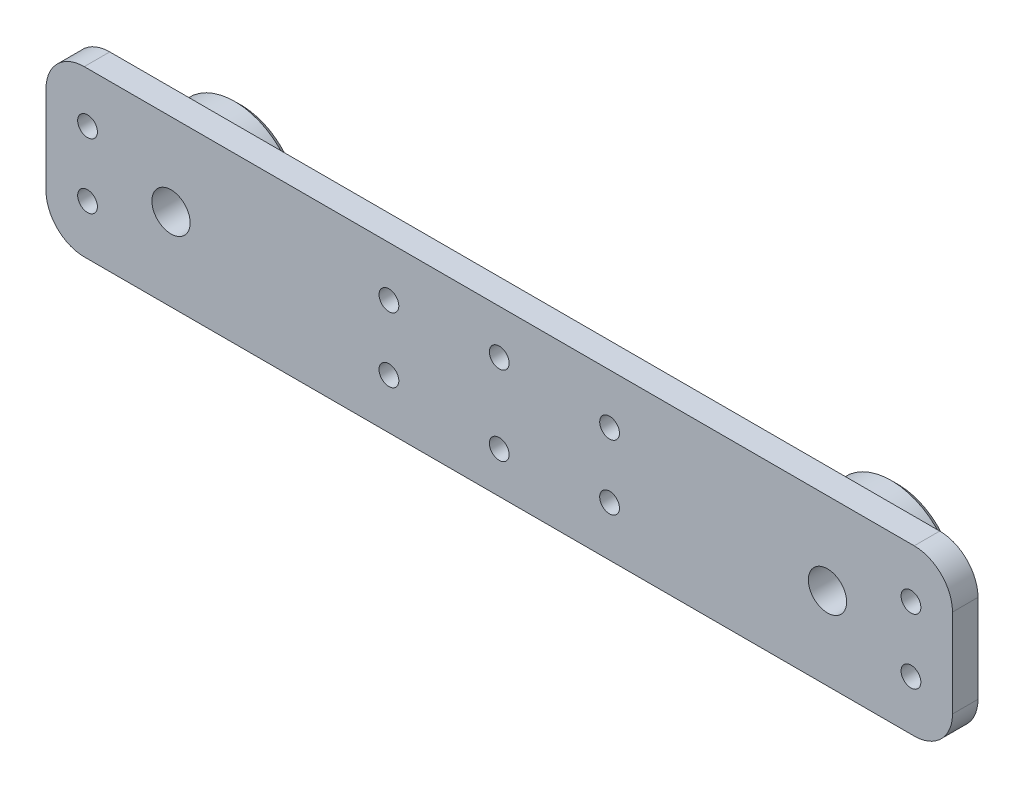
ISO-10303-21;
HEADER;
FILE_DESCRIPTION(('STEP AP214'),'2;1');
FILE_NAME('part.step','',(''),(''),'','','');
FILE_SCHEMA(('AUTOMOTIVE_DESIGN { 1 0 10303 214 1 1 1 1 }'));
ENDSEC;
DATA;
#1=APPLICATION_CONTEXT('core data for automotive mechanical design processes');
#2=APPLICATION_PROTOCOL_DEFINITION('international standard','automotive_design',2000,#1);
#3=PRODUCT_CONTEXT('',#1,'mechanical');
#4=PRODUCT('Part','Part','',(#3));
#5=PRODUCT_RELATED_PRODUCT_CATEGORY('part','',(#4));
#6=PRODUCT_DEFINITION_FORMATION('','',#4);
#7=PRODUCT_DEFINITION_CONTEXT('part definition',#1,'design');
#8=PRODUCT_DEFINITION('design','',#6,#7);
#9=PRODUCT_DEFINITION_SHAPE('','',#8);
#10=(LENGTH_UNIT() NAMED_UNIT(*) SI_UNIT(.MILLI.,.METRE.));
#11=(NAMED_UNIT(*) PLANE_ANGLE_UNIT() SI_UNIT($,.RADIAN.));
#12=(NAMED_UNIT(*) SI_UNIT($,.STERADIAN.) SOLID_ANGLE_UNIT());
#13=UNCERTAINTY_MEASURE_WITH_UNIT(LENGTH_MEASURE(1.E-05),#10,'distance_accuracy_value','');
#14=(GEOMETRIC_REPRESENTATION_CONTEXT(3) GLOBAL_UNCERTAINTY_ASSIGNED_CONTEXT((#13)) GLOBAL_UNIT_ASSIGNED_CONTEXT((#10,
#11,#12)) REPRESENTATION_CONTEXT('',''));
#15=CARTESIAN_POINT('',(0.,0.,0.));
#16=DIRECTION('',(0.,0.,1.));
#17=DIRECTION('',(1.,0.,0.));
#18=AXIS2_PLACEMENT_3D('',#15,#16,#17);
#19=CARTESIAN_POINT('',(112.00000166893,35.000000075492,-4.27901249411549));
#20=DIRECTION('',(1.,0.,0.));
#21=DIRECTION('',(0.,0.,-1.));
#22=AXIS2_PLACEMENT_3D('',#19,#20,#21);
#23=PLANE('',#22);
#24=DIRECTION('',(0.,-1.,0.));
#25=VECTOR('',#24,1.);
#26=CARTESIAN_POINT('',(112.00000166893,35.000000075492,-8.2790124941155));
#27=LINE('',#26,#25);
#28=CARTESIAN_POINT('',(112.00000166893,29.000000075492,-8.27901249411551));
#29=VERTEX_POINT('',#28);
#30=CARTESIAN_POINT('',(112.00000166893,15.1580243665273,-8.27901249411555));
#31=VERTEX_POINT('',#30);
#32=EDGE_CURVE('E156',#29,#31,#27,.T.);
#33=ORIENTED_EDGE('',*,*,#32,.F.);
#34=DIRECTION('',(0.,0.,-1.));
#35=VECTOR('',#34,1.);
#36=CARTESIAN_POINT('',(112.00000166893,29.000000075492,-4.2790124941155));
#37=LINE('',#36,#35);
#38=CARTESIAN_POINT('',(112.00000166893,29.000000075492,-4.2790124941155));
#39=VERTEX_POINT('',#38);
#40=EDGE_CURVE('E147',#29,#39,#37,.F.);
#41=ORIENTED_EDGE('',*,*,#40,.T.);
#42=DIRECTION('',(0.,-1.,0.));
#43=VECTOR('',#42,1.);
#44=CARTESIAN_POINT('',(112.00000166893,35.000000075492,-4.27901249411549));
#45=LINE('',#44,#43);
#46=CARTESIAN_POINT('',(112.00000166893,15.1580243665273,-4.27901249411554));
#47=VERTEX_POINT('',#46);
#48=EDGE_CURVE('E153',#39,#47,#45,.T.);
#49=ORIENTED_EDGE('',*,*,#48,.T.);
#50=DIRECTION('',(0.,0.,-1.));
#51=VECTOR('',#50,1.);
#52=CARTESIAN_POINT('',(112.00000166893,15.1580243665273,-4.27901249411554));
#53=LINE('',#52,#51);
#54=EDGE_CURVE('E144',#47,#31,#53,.T.);
#55=ORIENTED_EDGE('',*,*,#54,.T.);
#56=EDGE_LOOP('',(#33,#41,#49,#55));
#57=FACE_BOUND('',#56,.T.);
#58=ADVANCED_FACE('F33',(#57),#23,.T.);
#59=CARTESIAN_POINT('',(-30.1427177643065,35.000000075492,-4.27901249411549));
#60=DIRECTION('',(0.,1.,0.));
#61=DIRECTION('',(0.,0.,1.));
#62=AXIS2_PLACEMENT_3D('',#59,#60,#61);
#63=PLANE('',#62);
#64=DIRECTION('',(1.,0.,0.));
#65=VECTOR('',#64,1.);
#66=CARTESIAN_POINT('',(-30.1427177643065,35.000000075492,-8.2790124941155));
#67=LINE('',#66,#65);
#68=CARTESIAN_POINT('',(-24.1427177643065,35.000000075492,-8.2790124941155));
#69=VERTEX_POINT('',#68);
#70=CARTESIAN_POINT('',(106.00000166893,35.000000075492,-8.2790124941155));
#71=VERTEX_POINT('',#70);
#72=EDGE_CURVE('E117',#69,#71,#67,.T.);
#73=ORIENTED_EDGE('',*,*,#72,.F.);
#74=DIRECTION('',(0.,0.,-1.));
#75=VECTOR('',#74,1.);
#76=CARTESIAN_POINT('',(-24.1427177643065,35.000000075492,-4.27901249411549));
#77=LINE('',#76,#75);
#78=CARTESIAN_POINT('',(-24.1427177643065,35.000000075492,-4.27901249411549));
#79=VERTEX_POINT('',#78);
#80=EDGE_CURVE('E135',#69,#79,#77,.F.);
#81=ORIENTED_EDGE('',*,*,#80,.T.);
#82=DIRECTION('',(1.,0.,0.));
#83=VECTOR('',#82,1.);
#84=CARTESIAN_POINT('',(-30.1427177643065,35.000000075492,-4.27901249411549));
#85=LINE('',#84,#83);
#86=CARTESIAN_POINT('',(106.00000166893,35.000000075492,-4.27901249411549));
#87=VERTEX_POINT('',#86);
#88=EDGE_CURVE('E172',#79,#87,#85,.T.);
#89=ORIENTED_EDGE('',*,*,#88,.T.);
#90=DIRECTION('',(0.,0.,-1.));
#91=VECTOR('',#90,1.);
#92=CARTESIAN_POINT('',(106.00000166893,35.000000075492,-4.27901249411549));
#93=LINE('',#92,#91);
#94=EDGE_CURVE('E132',#87,#71,#93,.T.);
#95=ORIENTED_EDGE('',*,*,#94,.T.);
#96=EDGE_LOOP('',(#73,#81,#89,#95));
#97=FACE_BOUND('',#96,.T.);
#98=ADVANCED_FACE('F170',(#97),#63,.T.);
#99=CARTESIAN_POINT('',(-30.1427177643065,9.15802436652728,-4.27901249411555));
#100=DIRECTION('',(-1.,0.,0.));
#101=DIRECTION('',(0.,0.,1.));
#102=AXIS2_PLACEMENT_3D('',#99,#100,#101);
#103=PLANE('',#102);
#104=DIRECTION('',(0.,1.,0.));
#105=VECTOR('',#104,1.);
#106=CARTESIAN_POINT('',(-30.1427177643065,9.15802436652728,-4.27901249411555));
#107=LINE('',#106,#105);
#108=CARTESIAN_POINT('',(-30.1427177643065,15.1580243665273,-4.27901249411554));
#109=VERTEX_POINT('',#108);
#110=CARTESIAN_POINT('',(-30.1427177643065,29.000000075492,-4.2790124941155));
#111=VERTEX_POINT('',#110);
#112=EDGE_CURVE('E266',#109,#111,#107,.T.);
#113=ORIENTED_EDGE('',*,*,#112,.T.);
#114=DIRECTION('',(0.,0.,-1.));
#115=VECTOR('',#114,1.);
#116=CARTESIAN_POINT('',(-30.1427177643065,29.000000075492,-4.2790124941155));
#117=LINE('',#116,#115);
#118=CARTESIAN_POINT('',(-30.1427177643065,29.000000075492,-8.27901249411551));
#119=VERTEX_POINT('',#118);
#120=EDGE_CURVE('E116',#111,#119,#117,.T.);
#121=ORIENTED_EDGE('',*,*,#120,.T.);
#122=DIRECTION('',(0.,1.,0.));
#123=VECTOR('',#122,1.);
#124=CARTESIAN_POINT('',(-30.1427177643065,9.15802436652729,-8.27901249411556));
#125=LINE('',#124,#123);
#126=CARTESIAN_POINT('',(-30.1427177643065,15.1580243665273,-8.27901249411555));
#127=VERTEX_POINT('',#126);
#128=EDGE_CURVE('E102',#127,#119,#125,.T.);
#129=ORIENTED_EDGE('',*,*,#128,.F.);
#130=DIRECTION('',(0.,0.,-1.));
#131=VECTOR('',#130,1.);
#132=CARTESIAN_POINT('',(-30.1427177643065,15.1580243665273,-4.27901249411554));
#133=LINE('',#132,#131);
#134=EDGE_CURVE('E114',#127,#109,#133,.F.);
#135=ORIENTED_EDGE('',*,*,#134,.T.);
#136=EDGE_LOOP('',(#113,#121,#129,#135));
#137=FACE_BOUND('',#136,.T.);
#138=ADVANCED_FACE('F113',(#137),#103,.T.);
#139=CARTESIAN_POINT('',(112.00000166893,9.15802436652728,-4.27901249411555));
#140=DIRECTION('',(0.,-1.,0.));
#141=DIRECTION('',(0.,0.,-1.));
#142=AXIS2_PLACEMENT_3D('',#139,#140,#141);
#143=PLANE('',#142);
#144=DIRECTION('',(-1.,0.,0.));
#145=VECTOR('',#144,1.);
#146=CARTESIAN_POINT('',(112.00000166893,9.15802436652728,-4.27901249411555));
#147=LINE('',#146,#145);
#148=CARTESIAN_POINT('',(106.00000166893,9.15802436652728,-4.27901249411555));
#149=VERTEX_POINT('',#148);
#150=CARTESIAN_POINT('',(-24.1427177643065,9.15802436652728,-4.27901249411555));
#151=VERTEX_POINT('',#150);
#152=EDGE_CURVE('E163',#149,#151,#147,.T.);
#153=ORIENTED_EDGE('',*,*,#152,.T.);
#154=DIRECTION('',(0.,0.,-1.));
#155=VECTOR('',#154,1.);
#156=CARTESIAN_POINT('',(-24.1427177643065,9.15802436652728,-4.27901249411555));
#157=LINE('',#156,#155);
#158=CARTESIAN_POINT('',(-24.1427177643065,9.15802436652729,-8.27901249411556));
#159=VERTEX_POINT('',#158);
#160=EDGE_CURVE('E11',#151,#159,#157,.T.);
#161=ORIENTED_EDGE('',*,*,#160,.T.);
#162=DIRECTION('',(-1.,0.,0.));
#163=VECTOR('',#162,1.);
#164=CARTESIAN_POINT('',(112.00000166893,9.15802436652729,-8.27901249411556));
#165=LINE('',#164,#163);
#166=CARTESIAN_POINT('',(106.00000166893,9.15802436652729,-8.27901249411556));
#167=VERTEX_POINT('',#166);
#168=EDGE_CURVE('E103',#167,#159,#165,.T.);
#169=ORIENTED_EDGE('',*,*,#168,.F.);
#170=DIRECTION('',(0.,0.,-1.));
#171=VECTOR('',#170,1.);
#172=CARTESIAN_POINT('',(106.00000166893,9.15802436652728,-4.27901249411555));
#173=LINE('',#172,#171);
#174=EDGE_CURVE('E41',#167,#149,#173,.F.);
#175=ORIENTED_EDGE('',*,*,#174,.T.);
#176=EDGE_LOOP('',(#153,#161,#169,#175));
#177=FACE_BOUND('',#176,.T.);
#178=ADVANCED_FACE('F238',(#177),#143,.T.);
#179=CARTESIAN_POINT('',(0.,0.,-4.27901249411557));
#180=DIRECTION('',(0.,0.,-1.));
#181=DIRECTION('',(0.,1.,0.));
#182=AXIS2_PLACEMENT_3D('',#179,#180,#181);
#183=PLANE('',#182);
#184=CARTESIAN_POINT('',(92.3970016717397,22.0793441178217,-4.27901249411549));
#185=DIRECTION('',(0.,0.,-1.));
#186=DIRECTION('',(-1.,0.,0.));
#187=AXIS2_PLACEMENT_3D('',#184,#185,#186);
#188=CIRCLE('',#187,2.99999999999999);
#189=CARTESIAN_POINT('',(89.3970016717397,22.0793441178217,-4.27901249411549));
#190=VERTEX_POINT('',#189);
#191=EDGE_CURVE('E326',#190,#190,#188,.T.);
#192=ORIENTED_EDGE('',*,*,#191,.T.);
#193=EDGE_LOOP('',(#192));
#194=FACE_BOUND('',#193,.T.);
#195=CARTESIAN_POINT('',(-10.54,22.0790119479029,-4.27901249411549));
#196=DIRECTION('',(0.,0.,-1.));
#197=DIRECTION('',(-1.,0.,0.));
#198=AXIS2_PLACEMENT_3D('',#195,#196,#197);
#199=CIRCLE('',#198,2.99999999999999);
#200=CARTESIAN_POINT('',(-13.54,22.0790119479029,-4.27901249411549));
#201=VERTEX_POINT('',#200);
#202=EDGE_CURVE('E320',#201,#201,#199,.T.);
#203=ORIENTED_EDGE('',*,*,#202,.T.);
#204=EDGE_LOOP('',(#203));
#205=FACE_BOUND('',#204,.T.);
#206=CARTESIAN_POINT('',(40.9286419523118,28.0395063638246,-4.27901249411557));
#207=DIRECTION('',(0.,0.,1.));
#208=DIRECTION('',(1.,0.,0.));
#209=AXIS2_PLACEMENT_3D('',#206,#207,#208);
#210=CIRCLE('',#209,1.54999999999999);
#211=CARTESIAN_POINT('',(42.4786419523118,28.0395063638246,-4.27901249411557));
#212=VERTEX_POINT('',#211);
#213=EDGE_CURVE('E317',#212,#212,#210,.T.);
#214=ORIENTED_EDGE('',*,*,#213,.F.);
#215=EDGE_LOOP('',(#214));
#216=FACE_BOUND('',#215,.T.);
#217=CARTESIAN_POINT('',(40.9286419523118,15.6185182937685,-4.27901249411557));
#218=DIRECTION('',(0.,0.,1.));
#219=DIRECTION('',(1.,0.,0.));
#220=AXIS2_PLACEMENT_3D('',#217,#218,#219);
#221=CIRCLE('',#220,1.54999999999999);
#222=CARTESIAN_POINT('',(42.4786419523118,15.6185182937685,-4.27901249411557));
#223=VERTEX_POINT('',#222);
#224=EDGE_CURVE('E311',#223,#223,#221,.T.);
#225=ORIENTED_EDGE('',*,*,#224,.F.);
#226=EDGE_LOOP('',(#225));
#227=FACE_BOUND('',#226,.T.);
#228=CARTESIAN_POINT('',(58.2272839046234,27.1640124941167,-4.27901249411557));
#229=DIRECTION('',(0.,0.,1.));
#230=DIRECTION('',(1.,0.,0.));
#231=AXIS2_PLACEMENT_3D('',#228,#229,#230);
#232=CIRCLE('',#231,1.54999999999999);
#233=CARTESIAN_POINT('',(59.7772839046234,27.1640124941167,-4.27901249411557));
#234=VERTEX_POINT('',#233);
#235=EDGE_CURVE('E305',#234,#234,#232,.T.);
#236=ORIENTED_EDGE('',*,*,#235,.F.);
#237=EDGE_LOOP('',(#236));
#238=FACE_BOUND('',#237,.T.);
#239=CARTESIAN_POINT('',(23.63,27.1640119479028,-4.27901249411557));
#240=DIRECTION('',(0.,0.,1.));
#241=DIRECTION('',(1.,0.,0.));
#242=AXIS2_PLACEMENT_3D('',#239,#240,#241);
#243=CIRCLE('',#242,1.54999999999999);
#244=CARTESIAN_POINT('',(25.18,27.1640119479028,-4.27901249411557));
#245=VERTEX_POINT('',#244);
#246=EDGE_CURVE('E299',#245,#245,#243,.T.);
#247=ORIENTED_EDGE('',*,*,#246,.F.);
#248=EDGE_LOOP('',(#247));
#249=FACE_BOUND('',#248,.T.);
#250=CARTESIAN_POINT('',(-23.63,27.1640119479028,-4.27901249411557));
#251=DIRECTION('',(0.,0.,1.));
#252=DIRECTION('',(1.,0.,0.));
#253=AXIS2_PLACEMENT_3D('',#250,#251,#252);
#254=CIRCLE('',#253,1.54999999999999);
#255=CARTESIAN_POINT('',(-22.08,27.1640119479028,-4.27901249411557));
#256=VERTEX_POINT('',#255);
#257=EDGE_CURVE('E293',#256,#256,#254,.T.);
#258=ORIENTED_EDGE('',*,*,#257,.F.);
#259=EDGE_LOOP('',(#258));
#260=FACE_BOUND('',#259,.T.);
#261=CARTESIAN_POINT('',(-23.63,16.9940119479028,-4.27901249411557));
#262=DIRECTION('',(0.,0.,1.));
#263=DIRECTION('',(1.,0.,0.));
#264=AXIS2_PLACEMENT_3D('',#261,#262,#263);
#265=CIRCLE('',#264,1.54999999999999);
#266=CARTESIAN_POINT('',(-22.08,16.9940119479028,-4.27901249411557));
#267=VERTEX_POINT('',#266);
#268=EDGE_CURVE('E184',#267,#267,#265,.T.);
#269=ORIENTED_EDGE('',*,*,#268,.F.);
#270=EDGE_LOOP('',(#269));
#271=FACE_BOUND('',#270,.T.);
#272=CARTESIAN_POINT('',(23.63,16.9940119479028,-4.27901249411557));
#273=DIRECTION('',(0.,0.,1.));
#274=DIRECTION('',(1.,0.,0.));
#275=AXIS2_PLACEMENT_3D('',#272,#273,#274);
#276=CIRCLE('',#275,1.54999999999999);
#277=CARTESIAN_POINT('',(25.18,16.9940119479028,-4.27901249411557));
#278=VERTEX_POINT('',#277);
#279=EDGE_CURVE('E183',#278,#278,#276,.T.);
#280=ORIENTED_EDGE('',*,*,#279,.F.);
#281=EDGE_LOOP('',(#280));
#282=FACE_BOUND('',#281,.T.);
#283=CARTESIAN_POINT('',(58.2272839046231,16.9940124941167,-4.27901249411557));
#284=DIRECTION('',(0.,0.,1.));
#285=DIRECTION('',(1.,0.,0.));
#286=AXIS2_PLACEMENT_3D('',#283,#284,#285);
#287=CIRCLE('',#286,1.54999999999999);
#288=CARTESIAN_POINT('',(59.7772839046231,16.9940124941167,-4.27901249411557));
#289=VERTEX_POINT('',#288);
#290=EDGE_CURVE('E280',#289,#289,#287,.T.);
#291=ORIENTED_EDGE('',*,*,#290,.F.);
#292=EDGE_LOOP('',(#291));
#293=FACE_BOUND('',#292,.T.);
#294=CARTESIAN_POINT('',(105.487283904623,27.1640124941154,-4.27901249411557));
#295=DIRECTION('',(0.,0.,1.));
#296=DIRECTION('',(1.,0.,0.));
#297=AXIS2_PLACEMENT_3D('',#294,#295,#296);
#298=CIRCLE('',#297,1.54999999999998);
#299=CARTESIAN_POINT('',(107.037283904623,27.1640124941154,-4.27901249411557));
#300=VERTEX_POINT('',#299);
#301=EDGE_CURVE('E274',#300,#300,#298,.T.);
#302=ORIENTED_EDGE('',*,*,#301,.F.);
#303=EDGE_LOOP('',(#302));
#304=FACE_BOUND('',#303,.T.);
#305=CARTESIAN_POINT('',(105.487283904623,16.9940124941154,-4.27901249411557));
#306=DIRECTION('',(0.,0.,1.));
#307=DIRECTION('',(1.,0.,0.));
#308=AXIS2_PLACEMENT_3D('',#305,#306,#307);
#309=CIRCLE('',#308,1.54999999999998);
#310=CARTESIAN_POINT('',(107.037283904623,16.9940124941154,-4.27901249411557));
#311=VERTEX_POINT('',#310);
#312=EDGE_CURVE('E179',#311,#311,#309,.T.);
#313=ORIENTED_EDGE('',*,*,#312,.F.);
#314=EDGE_LOOP('',(#313));
#315=FACE_BOUND('',#314,.T.);
#316=ORIENTED_EDGE('',*,*,#88,.F.);
#317=CARTESIAN_POINT('',(-24.1427177643065,29.000000075492,-4.2790124941155));
#318=DIRECTION('',(0.,0.,-1.));
#319=DIRECTION('',(0.,1.,0.));
#320=AXIS2_PLACEMENT_3D('',#317,#318,#319);
#321=CIRCLE('',#320,6.);
#322=EDGE_CURVE('E142',#79,#111,#321,.F.);
#323=ORIENTED_EDGE('',*,*,#322,.T.);
#324=ORIENTED_EDGE('',*,*,#112,.F.);
#325=CARTESIAN_POINT('',(-24.1427177643065,15.1580243665273,-4.27901249411554));
#326=DIRECTION('',(0.,0.,-1.));
#327=DIRECTION('',(0.,1.,0.));
#328=AXIS2_PLACEMENT_3D('',#325,#326,#327);
#329=CIRCLE('',#328,6.);
#330=EDGE_CURVE('E48',#109,#151,#329,.F.);
#331=ORIENTED_EDGE('',*,*,#330,.T.);
#332=ORIENTED_EDGE('',*,*,#152,.F.);
#333=CARTESIAN_POINT('',(106.00000166893,15.1580243665273,-4.27901249411554));
#334=DIRECTION('',(0.,0.,-1.));
#335=DIRECTION('',(0.,1.,0.));
#336=AXIS2_PLACEMENT_3D('',#333,#334,#335);
#337=CIRCLE('',#336,6.);
#338=EDGE_CURVE('E137',#149,#47,#337,.F.);
#339=ORIENTED_EDGE('',*,*,#338,.T.);
#340=ORIENTED_EDGE('',*,*,#48,.F.);
#341=CARTESIAN_POINT('',(106.00000166893,29.000000075492,-4.2790124941155));
#342=DIRECTION('',(0.,0.,-1.));
#343=DIRECTION('',(0.,1.,0.));
#344=AXIS2_PLACEMENT_3D('',#341,#342,#343);
#345=CIRCLE('',#344,6.);
#346=EDGE_CURVE('E140',#39,#87,#345,.F.);
#347=ORIENTED_EDGE('',*,*,#346,.T.);
#348=EDGE_LOOP('',(#316,#323,#324,#331,#332,#339,#340,#347));
#349=FACE_BOUND('',#348,.T.);
#350=ADVANCED_FACE('F160',(#194,#205,#216,#227,#238,#249,#260,#271,#282,#293,#304,#315,#349),
#183,.F.);
#351=CARTESIAN_POINT('',(0.,0.,-8.27901249411558));
#352=DIRECTION('',(0.,0.,-1.));
#353=DIRECTION('',(0.,1.,0.));
#354=AXIS2_PLACEMENT_3D('',#351,#352,#353);
#355=PLANE('',#354);
#356=CARTESIAN_POINT('',(92.3970016717397,22.0790119479028,-8.27901249411553));
#357=DIRECTION('',(0.,0.,-1.));
#358=DIRECTION('',(0.,1.,0.));
#359=AXIS2_PLACEMENT_3D('',#356,#357,#358);
#360=CIRCLE('',#359,11.0000000000008);
#361=CARTESIAN_POINT('',(92.3970016717397,33.0790119479036,-8.2790124941155));
#362=VERTEX_POINT('',#361);
#363=EDGE_CURVE('E194',#362,#362,#360,.F.);
#364=ORIENTED_EDGE('',*,*,#363,.T.);
#365=EDGE_LOOP('',(#364));
#366=FACE_BOUND('',#365,.T.);
#367=CARTESIAN_POINT('',(-10.5400000000001,22.0790119479028,-8.27901249411553));
#368=DIRECTION('',(0.,0.,-1.));
#369=DIRECTION('',(0.,1.,0.));
#370=AXIS2_PLACEMENT_3D('',#367,#368,#369);
#371=CIRCLE('',#370,11.0000000000006);
#372=CARTESIAN_POINT('',(-10.5400000000001,33.0790119479034,-8.2790124941155));
#373=VERTEX_POINT('',#372);
#374=EDGE_CURVE('E191',#373,#373,#371,.F.);
#375=ORIENTED_EDGE('',*,*,#374,.T.);
#376=EDGE_LOOP('',(#375));
#377=FACE_BOUND('',#376,.T.);
#378=CARTESIAN_POINT('',(40.9286419523118,28.0395063638246,-8.27901249411551));
#379=DIRECTION('',(0.,0.,-1.));
#380=DIRECTION('',(0.,1.,0.));
#381=AXIS2_PLACEMENT_3D('',#378,#379,#380);
#382=CIRCLE('',#381,1.54999999999999);
#383=CARTESIAN_POINT('',(40.9286419523118,29.5895063638246,-8.27901249411551));
#384=VERTEX_POINT('',#383);
#385=EDGE_CURVE('E314',#384,#384,#382,.T.);
#386=ORIENTED_EDGE('',*,*,#385,.F.);
#387=EDGE_LOOP('',(#386));
#388=FACE_BOUND('',#387,.T.);
#389=CARTESIAN_POINT('',(40.9286419523118,15.6185182937685,-8.27901249411554));
#390=DIRECTION('',(0.,0.,-1.));
#391=DIRECTION('',(0.,1.,0.));
#392=AXIS2_PLACEMENT_3D('',#389,#390,#391);
#393=CIRCLE('',#392,1.54999999999999);
#394=CARTESIAN_POINT('',(40.9286419523118,17.1685182937685,-8.27901249411554));
#395=VERTEX_POINT('',#394);
#396=EDGE_CURVE('E308',#395,#395,#393,.T.);
#397=ORIENTED_EDGE('',*,*,#396,.F.);
#398=EDGE_LOOP('',(#397));
#399=FACE_BOUND('',#398,.T.);
#400=CARTESIAN_POINT('',(58.2272839046234,27.1640124941167,-8.27901249411552));
#401=DIRECTION('',(0.,0.,-1.));
#402=DIRECTION('',(0.,1.,0.));
#403=AXIS2_PLACEMENT_3D('',#400,#401,#402);
#404=CIRCLE('',#403,1.54999999999999);
#405=CARTESIAN_POINT('',(58.2272839046234,28.7140124941167,-8.27901249411551));
#406=VERTEX_POINT('',#405);
#407=EDGE_CURVE('E302',#406,#406,#404,.T.);
#408=ORIENTED_EDGE('',*,*,#407,.F.);
#409=EDGE_LOOP('',(#408));
#410=FACE_BOUND('',#409,.T.);
#411=CARTESIAN_POINT('',(23.63,27.1640119479028,-8.27901249411552));
#412=DIRECTION('',(0.,0.,-1.));
#413=DIRECTION('',(0.,1.,0.));
#414=AXIS2_PLACEMENT_3D('',#411,#412,#413);
#415=CIRCLE('',#414,1.54999999999999);
#416=CARTESIAN_POINT('',(23.63,28.7140119479028,-8.27901249411551));
#417=VERTEX_POINT('',#416);
#418=EDGE_CURVE('E296',#417,#417,#415,.T.);
#419=ORIENTED_EDGE('',*,*,#418,.F.);
#420=EDGE_LOOP('',(#419));
#421=FACE_BOUND('',#420,.T.);
#422=CARTESIAN_POINT('',(-23.63,27.1640119479028,-8.27901249411552));
#423=DIRECTION('',(0.,0.,-1.));
#424=DIRECTION('',(0.,1.,0.));
#425=AXIS2_PLACEMENT_3D('',#422,#423,#424);
#426=CIRCLE('',#425,1.54999999999999);
#427=CARTESIAN_POINT('',(-23.63,28.7140119479028,-8.27901249411551));
#428=VERTEX_POINT('',#427);
#429=EDGE_CURVE('E290',#428,#428,#426,.T.);
#430=ORIENTED_EDGE('',*,*,#429,.F.);
#431=EDGE_LOOP('',(#430));
#432=FACE_BOUND('',#431,.T.);
#433=CARTESIAN_POINT('',(-23.63,16.9940119479028,-8.27901249411554));
#434=DIRECTION('',(0.,0.,-1.));
#435=DIRECTION('',(0.,1.,0.));
#436=AXIS2_PLACEMENT_3D('',#433,#434,#435);
#437=CIRCLE('',#436,1.54999999999999);
#438=CARTESIAN_POINT('',(-23.63,18.5440119479028,-8.27901249411554));
#439=VERTEX_POINT('',#438);
#440=EDGE_CURVE('E180',#439,#439,#437,.T.);
#441=ORIENTED_EDGE('',*,*,#440,.F.);
#442=EDGE_LOOP('',(#441));
#443=FACE_BOUND('',#442,.T.);
#444=CARTESIAN_POINT('',(23.63,16.9940119479028,-8.27901249411554));
#445=DIRECTION('',(0.,0.,-1.));
#446=DIRECTION('',(0.,1.,0.));
#447=AXIS2_PLACEMENT_3D('',#444,#445,#446);
#448=CIRCLE('',#447,1.54999999999999);
#449=CARTESIAN_POINT('',(23.63,18.5440119479028,-8.27901249411554));
#450=VERTEX_POINT('',#449);
#451=EDGE_CURVE('E283',#450,#450,#448,.T.);
#452=ORIENTED_EDGE('',*,*,#451,.F.);
#453=EDGE_LOOP('',(#452));
#454=FACE_BOUND('',#453,.T.);
#455=CARTESIAN_POINT('',(58.2272839046231,16.9940124941167,-8.27901249411554));
#456=DIRECTION('',(0.,0.,-1.));
#457=DIRECTION('',(0.,1.,0.));
#458=AXIS2_PLACEMENT_3D('',#455,#456,#457);
#459=CIRCLE('',#458,1.54999999999999);
#460=CARTESIAN_POINT('',(58.2272839046231,18.5440124941167,-8.27901249411554));
#461=VERTEX_POINT('',#460);
#462=EDGE_CURVE('E277',#461,#461,#459,.T.);
#463=ORIENTED_EDGE('',*,*,#462,.F.);
#464=EDGE_LOOP('',(#463));
#465=FACE_BOUND('',#464,.T.);
#466=CARTESIAN_POINT('',(105.487283904623,27.1640124941154,-8.27901249411552));
#467=DIRECTION('',(0.,0.,-1.));
#468=DIRECTION('',(0.,1.,0.));
#469=AXIS2_PLACEMENT_3D('',#466,#467,#468);
#470=CIRCLE('',#469,1.54999999999998);
#471=CARTESIAN_POINT('',(105.487283904623,28.7140124941154,-8.27901249411551));
#472=VERTEX_POINT('',#471);
#473=EDGE_CURVE('E271',#472,#472,#470,.T.);
#474=ORIENTED_EDGE('',*,*,#473,.F.);
#475=EDGE_LOOP('',(#474));
#476=FACE_BOUND('',#475,.T.);
#477=CARTESIAN_POINT('',(105.487283904623,16.9940124941154,-8.27901249411554));
#478=DIRECTION('',(0.,0.,-1.));
#479=DIRECTION('',(0.,1.,0.));
#480=AXIS2_PLACEMENT_3D('',#477,#478,#479);
#481=CIRCLE('',#480,1.54999999999998);
#482=CARTESIAN_POINT('',(105.487283904623,18.5440124941154,-8.27901249411554));
#483=VERTEX_POINT('',#482);
#484=EDGE_CURVE('E176',#483,#483,#481,.T.);
#485=ORIENTED_EDGE('',*,*,#484,.F.);
#486=EDGE_LOOP('',(#485));
#487=FACE_BOUND('',#486,.T.);
#488=ORIENTED_EDGE('',*,*,#128,.T.);
#489=CARTESIAN_POINT('',(-24.1427177643065,29.000000075492,-8.27901249411551));
#490=DIRECTION('',(0.,0.,-1.));
#491=DIRECTION('',(0.,1.,0.));
#492=AXIS2_PLACEMENT_3D('',#489,#490,#491);
#493=CIRCLE('',#492,6.);
#494=EDGE_CURVE('E130',#119,#69,#493,.T.);
#495=ORIENTED_EDGE('',*,*,#494,.T.);
#496=ORIENTED_EDGE('',*,*,#72,.T.);
#497=CARTESIAN_POINT('',(106.00000166893,29.000000075492,-8.27901249411551));
#498=DIRECTION('',(0.,0.,-1.));
#499=DIRECTION('',(0.,1.,0.));
#500=AXIS2_PLACEMENT_3D('',#497,#498,#499);
#501=CIRCLE('',#500,6.);
#502=EDGE_CURVE('E107',#71,#29,#501,.T.);
#503=ORIENTED_EDGE('',*,*,#502,.T.);
#504=ORIENTED_EDGE('',*,*,#32,.T.);
#505=CARTESIAN_POINT('',(106.00000166893,15.1580243665273,-8.27901249411555));
#506=DIRECTION('',(0.,0.,-1.));
#507=DIRECTION('',(0.,1.,0.));
#508=AXIS2_PLACEMENT_3D('',#505,#506,#507);
#509=CIRCLE('',#508,6.);
#510=EDGE_CURVE('E108',#31,#167,#509,.T.);
#511=ORIENTED_EDGE('',*,*,#510,.T.);
#512=ORIENTED_EDGE('',*,*,#168,.T.);
#513=CARTESIAN_POINT('',(-24.1427177643065,15.1580243665273,-8.27901249411555));
#514=DIRECTION('',(0.,0.,-1.));
#515=DIRECTION('',(0.,1.,0.));
#516=AXIS2_PLACEMENT_3D('',#513,#514,#515);
#517=CIRCLE('',#516,6.);
#518=EDGE_CURVE('E99',#159,#127,#517,.T.);
#519=ORIENTED_EDGE('',*,*,#518,.T.);
#520=EDGE_LOOP('',(#488,#495,#496,#503,#504,#511,#512,#519));
#521=FACE_BOUND('',#520,.T.);
#522=ADVANCED_FACE('F101',(#366,#377,#388,#399,#410,#421,#432,#443,#454,#465,#476,#487,#521),
#355,.T.);
#523=CARTESIAN_POINT('',(-10.5400000000001,22.0790119479028,-15.2790124941155));
#524=DIRECTION('',(0.,0.,1.));
#525=DIRECTION('',(1.,0.,0.));
#526=AXIS2_PLACEMENT_3D('',#523,#524,#525);
#527=CYLINDRICAL_SURFACE('',#526,10.);
#528=CARTESIAN_POINT('',(-10.5400000000001,22.0790119479028,-9.27901249411611));
#529=DIRECTION('',(0.,0.,-1.));
#530=DIRECTION('',(-1.,0.,0.));
#531=AXIS2_PLACEMENT_3D('',#528,#529,#530);
#532=CIRCLE('',#531,10.);
#533=CARTESIAN_POINT('',(-20.5400000000002,22.0790119479028,-9.27901249411612));
#534=VERTEX_POINT('',#533);
#535=EDGE_CURVE('E200',#534,#534,#532,.T.);
#536=ORIENTED_EDGE('',*,*,#535,.T.);
#537=EDGE_LOOP('',(#536));
#538=FACE_BOUND('',#537,.T.);
#539=CARTESIAN_POINT('',(-10.5400000000001,22.0790119479028,-14.279012494115));
#540=DIRECTION('',(0.,0.,-1.));
#541=DIRECTION('',(-1.,0.,0.));
#542=AXIS2_PLACEMENT_3D('',#539,#540,#541);
#543=CIRCLE('',#542,10.);
#544=CARTESIAN_POINT('',(-20.5400000000001,22.0790119479028,-14.279012494115));
#545=VERTEX_POINT('',#544);
#546=EDGE_CURVE('E197',#545,#545,#543,.F.);
#547=ORIENTED_EDGE('',*,*,#546,.T.);
#548=EDGE_LOOP('',(#547));
#549=FACE_BOUND('',#548,.T.);
#550=ADVANCED_FACE('F227',(#538,#549),#527,.T.);
#551=CARTESIAN_POINT('',(-0.540000000000047,22.0790119479028,-15.2790124941155));
#552=DIRECTION('',(0.,0.,-1.));
#553=DIRECTION('',(-1.,0.,0.));
#554=AXIS2_PLACEMENT_3D('',#551,#552,#553);
#555=PLANE('',#554);
#556=CARTESIAN_POINT('',(-10.5400000000001,22.0790119479028,-15.2790124941155));
#557=DIRECTION('',(0.,0.,-1.));
#558=DIRECTION('',(-1.,0.,0.));
#559=AXIS2_PLACEMENT_3D('',#556,#557,#558);
#560=CIRCLE('',#559,8.99999999999951);
#561=CARTESIAN_POINT('',(-19.5399999999996,22.0790119479028,-15.2790124941155));
#562=VERTEX_POINT('',#561);
#563=EDGE_CURVE('E120',#562,#562,#560,.T.);
#564=ORIENTED_EDGE('',*,*,#563,.T.);
#565=EDGE_LOOP('',(#564));
#566=FACE_BOUND('',#565,.T.);
#567=CARTESIAN_POINT('',(-10.54,22.0790119479029,-15.2790124941155));
#568=DIRECTION('',(0.,0.,-1.));
#569=DIRECTION('',(-1.,0.,0.));
#570=AXIS2_PLACEMENT_3D('',#567,#568,#569);
#571=CIRCLE('',#570,2.99999999999999);
#572=CARTESIAN_POINT('',(-13.54,22.0790119479029,-15.2790124941155));
#573=VERTEX_POINT('',#572);
#574=EDGE_CURVE('E323',#573,#573,#571,.T.);
#575=ORIENTED_EDGE('',*,*,#574,.F.);
#576=EDGE_LOOP('',(#575));
#577=FACE_BOUND('',#576,.T.);
#578=ADVANCED_FACE('F218',(#566,#577),#555,.T.);
#579=CARTESIAN_POINT('',(92.3970016717397,22.0790119479028,-15.2790124941155));
#580=DIRECTION('',(0.,0.,1.));
#581=DIRECTION('',(1.,0.,0.));
#582=AXIS2_PLACEMENT_3D('',#579,#580,#581);
#583=CYLINDRICAL_SURFACE('',#582,10.0000000000001);
#584=CARTESIAN_POINT('',(92.3970016717397,22.0790119479028,-9.27901249411613));
#585=DIRECTION('',(0.,0.,-1.));
#586=DIRECTION('',(-1.,0.,0.));
#587=AXIS2_PLACEMENT_3D('',#584,#585,#586);
#588=CIRCLE('',#587,10.0000000000001);
#589=CARTESIAN_POINT('',(82.3970016717395,22.0790119479028,-9.27901249411613));
#590=VERTEX_POINT('',#589);
#591=EDGE_CURVE('E188',#590,#590,#588,.T.);
#592=ORIENTED_EDGE('',*,*,#591,.T.);
#593=EDGE_LOOP('',(#592));
#594=FACE_BOUND('',#593,.T.);
#595=CARTESIAN_POINT('',(92.3970016717397,22.0790119479028,-14.2790124941149));
#596=DIRECTION('',(0.,0.,-1.));
#597=DIRECTION('',(-1.,0.,0.));
#598=AXIS2_PLACEMENT_3D('',#595,#596,#597);
#599=CIRCLE('',#598,10.0000000000001);
#600=CARTESIAN_POINT('',(82.3970016717395,22.0790119479028,-14.2790124941149));
#601=VERTEX_POINT('',#600);
#602=EDGE_CURVE('E185',#601,#601,#599,.F.);
#603=ORIENTED_EDGE('',*,*,#602,.T.);
#604=EDGE_LOOP('',(#603));
#605=FACE_BOUND('',#604,.T.);
#606=ADVANCED_FACE('F216',(#594,#605),#583,.T.);
#607=CARTESIAN_POINT('',(102.39700167174,22.0790119479028,-15.2790124941155));
#608=DIRECTION('',(0.,0.,-1.));
#609=DIRECTION('',(-1.,0.,0.));
#610=AXIS2_PLACEMENT_3D('',#607,#608,#609);
#611=PLANE('',#610);
#612=CARTESIAN_POINT('',(92.3970016717397,22.0790119479028,-15.2790124941155));
#613=DIRECTION('',(0.,0.,-1.));
#614=DIRECTION('',(-1.,0.,0.));
#615=AXIS2_PLACEMENT_3D('',#612,#613,#614);
#616=CIRCLE('',#615,8.99999999999959);
#617=CARTESIAN_POINT('',(83.3970016717401,22.0790119479028,-15.2790124941155));
#618=VERTEX_POINT('',#617);
#619=EDGE_CURVE('E124',#618,#618,#616,.T.);
#620=ORIENTED_EDGE('',*,*,#619,.T.);
#621=EDGE_LOOP('',(#620));
#622=FACE_BOUND('',#621,.T.);
#623=CARTESIAN_POINT('',(92.3970016717397,22.0793441178217,-15.2790124941155));
#624=DIRECTION('',(0.,0.,-1.));
#625=DIRECTION('',(-1.,0.,0.));
#626=AXIS2_PLACEMENT_3D('',#623,#624,#625);
#627=CIRCLE('',#626,2.99999999999999);
#628=CARTESIAN_POINT('',(89.3970016717397,22.0793441178217,-15.2790124941155));
#629=VERTEX_POINT('',#628);
#630=EDGE_CURVE('E329',#629,#629,#627,.T.);
#631=ORIENTED_EDGE('',*,*,#630,.F.);
#632=EDGE_LOOP('',(#631));
#633=FACE_BOUND('',#632,.T.);
#634=ADVANCED_FACE('F205',(#622,#633),#611,.T.);
#635=CARTESIAN_POINT('',(105.487283904623,16.9940124941154,-4.27901249411557));
#636=DIRECTION('',(0.,0.,1.));
#637=DIRECTION('',(1.,0.,0.));
#638=AXIS2_PLACEMENT_3D('',#635,#636,#637);
#639=CYLINDRICAL_SURFACE('',#638,1.54999999999998);
#640=ORIENTED_EDGE('',*,*,#484,.T.);
#641=EDGE_LOOP('',(#640));
#642=FACE_BOUND('',#641,.T.);
#643=ORIENTED_EDGE('',*,*,#312,.T.);
#644=EDGE_LOOP('',(#643));
#645=FACE_BOUND('',#644,.T.);
#646=ADVANCED_FACE('F225',(#642,#645),#639,.F.);
#647=CARTESIAN_POINT('',(105.487283904623,27.1640124941154,-4.27901249411557));
#648=DIRECTION('',(0.,0.,1.));
#649=DIRECTION('',(1.,0.,0.));
#650=AXIS2_PLACEMENT_3D('',#647,#648,#649);
#651=CYLINDRICAL_SURFACE('',#650,1.54999999999998);
#652=ORIENTED_EDGE('',*,*,#473,.T.);
#653=EDGE_LOOP('',(#652));
#654=FACE_BOUND('',#653,.T.);
#655=ORIENTED_EDGE('',*,*,#301,.T.);
#656=EDGE_LOOP('',(#655));
#657=FACE_BOUND('',#656,.T.);
#658=ADVANCED_FACE('F375',(#654,#657),#651,.F.);
#659=CARTESIAN_POINT('',(58.2272839046231,16.9940124941167,-4.27901249411557));
#660=DIRECTION('',(0.,0.,1.));
#661=DIRECTION('',(1.,0.,0.));
#662=AXIS2_PLACEMENT_3D('',#659,#660,#661);
#663=CYLINDRICAL_SURFACE('',#662,1.54999999999999);
#664=ORIENTED_EDGE('',*,*,#462,.T.);
#665=EDGE_LOOP('',(#664));
#666=FACE_BOUND('',#665,.T.);
#667=ORIENTED_EDGE('',*,*,#290,.T.);
#668=EDGE_LOOP('',(#667));
#669=FACE_BOUND('',#668,.T.);
#670=ADVANCED_FACE('F371',(#666,#669),#663,.F.);
#671=CARTESIAN_POINT('',(23.63,16.9940119479028,-4.27901249411557));
#672=DIRECTION('',(0.,0.,1.));
#673=DIRECTION('',(1.,0.,0.));
#674=AXIS2_PLACEMENT_3D('',#671,#672,#673);
#675=CYLINDRICAL_SURFACE('',#674,1.54999999999999);
#676=ORIENTED_EDGE('',*,*,#451,.T.);
#677=EDGE_LOOP('',(#676));
#678=FACE_BOUND('',#677,.T.);
#679=ORIENTED_EDGE('',*,*,#279,.T.);
#680=EDGE_LOOP('',(#679));
#681=FACE_BOUND('',#680,.T.);
#682=ADVANCED_FACE('F367',(#678,#681),#675,.F.);
#683=CARTESIAN_POINT('',(-23.63,16.9940119479028,-4.27901249411557));
#684=DIRECTION('',(0.,0.,1.));
#685=DIRECTION('',(1.,0.,0.));
#686=AXIS2_PLACEMENT_3D('',#683,#684,#685);
#687=CYLINDRICAL_SURFACE('',#686,1.54999999999999);
#688=ORIENTED_EDGE('',*,*,#440,.T.);
#689=EDGE_LOOP('',(#688));
#690=FACE_BOUND('',#689,.T.);
#691=ORIENTED_EDGE('',*,*,#268,.T.);
#692=EDGE_LOOP('',(#691));
#693=FACE_BOUND('',#692,.T.);
#694=ADVANCED_FACE('F363',(#690,#693),#687,.F.);
#695=CARTESIAN_POINT('',(-23.63,27.1640119479028,-4.27901249411557));
#696=DIRECTION('',(0.,0.,1.));
#697=DIRECTION('',(1.,0.,0.));
#698=AXIS2_PLACEMENT_3D('',#695,#696,#697);
#699=CYLINDRICAL_SURFACE('',#698,1.54999999999999);
#700=ORIENTED_EDGE('',*,*,#429,.T.);
#701=EDGE_LOOP('',(#700));
#702=FACE_BOUND('',#701,.T.);
#703=ORIENTED_EDGE('',*,*,#257,.T.);
#704=EDGE_LOOP('',(#703));
#705=FACE_BOUND('',#704,.T.);
#706=ADVANCED_FACE('F359',(#702,#705),#699,.F.);
#707=CARTESIAN_POINT('',(23.63,27.1640119479028,-4.27901249411557));
#708=DIRECTION('',(0.,0.,1.));
#709=DIRECTION('',(1.,0.,0.));
#710=AXIS2_PLACEMENT_3D('',#707,#708,#709);
#711=CYLINDRICAL_SURFACE('',#710,1.54999999999999);
#712=ORIENTED_EDGE('',*,*,#418,.T.);
#713=EDGE_LOOP('',(#712));
#714=FACE_BOUND('',#713,.T.);
#715=ORIENTED_EDGE('',*,*,#246,.T.);
#716=EDGE_LOOP('',(#715));
#717=FACE_BOUND('',#716,.T.);
#718=ADVANCED_FACE('F355',(#714,#717),#711,.F.);
#719=CARTESIAN_POINT('',(58.2272839046234,27.1640124941167,-4.27901249411557));
#720=DIRECTION('',(0.,0.,1.));
#721=DIRECTION('',(1.,0.,0.));
#722=AXIS2_PLACEMENT_3D('',#719,#720,#721);
#723=CYLINDRICAL_SURFACE('',#722,1.54999999999999);
#724=ORIENTED_EDGE('',*,*,#407,.T.);
#725=EDGE_LOOP('',(#724));
#726=FACE_BOUND('',#725,.T.);
#727=ORIENTED_EDGE('',*,*,#235,.T.);
#728=EDGE_LOOP('',(#727));
#729=FACE_BOUND('',#728,.T.);
#730=ADVANCED_FACE('F351',(#726,#729),#723,.F.);
#731=CARTESIAN_POINT('',(40.9286419523118,15.6185182937685,-4.27901249411557));
#732=DIRECTION('',(0.,0.,1.));
#733=DIRECTION('',(1.,0.,0.));
#734=AXIS2_PLACEMENT_3D('',#731,#732,#733);
#735=CYLINDRICAL_SURFACE('',#734,1.54999999999999);
#736=ORIENTED_EDGE('',*,*,#396,.T.);
#737=EDGE_LOOP('',(#736));
#738=FACE_BOUND('',#737,.T.);
#739=ORIENTED_EDGE('',*,*,#224,.T.);
#740=EDGE_LOOP('',(#739));
#741=FACE_BOUND('',#740,.T.);
#742=ADVANCED_FACE('F347',(#738,#741),#735,.F.);
#743=CARTESIAN_POINT('',(40.9286419523118,28.0395063638246,-4.27901249411557));
#744=DIRECTION('',(0.,0.,1.));
#745=DIRECTION('',(1.,0.,0.));
#746=AXIS2_PLACEMENT_3D('',#743,#744,#745);
#747=CYLINDRICAL_SURFACE('',#746,1.54999999999999);
#748=ORIENTED_EDGE('',*,*,#385,.T.);
#749=EDGE_LOOP('',(#748));
#750=FACE_BOUND('',#749,.T.);
#751=ORIENTED_EDGE('',*,*,#213,.T.);
#752=EDGE_LOOP('',(#751));
#753=FACE_BOUND('',#752,.T.);
#754=ADVANCED_FACE('F340',(#750,#753),#747,.F.);
#755=CARTESIAN_POINT('',(-10.54,22.0790119479029,-15.2790124941155));
#756=DIRECTION('',(0.,0.,-1.));
#757=DIRECTION('',(-1.,0.,0.));
#758=AXIS2_PLACEMENT_3D('',#755,#756,#757);
#759=CYLINDRICAL_SURFACE('',#758,2.99999999999999);
#760=ORIENTED_EDGE('',*,*,#202,.F.);
#761=EDGE_LOOP('',(#760));
#762=FACE_BOUND('',#761,.T.);
#763=ORIENTED_EDGE('',*,*,#574,.T.);
#764=EDGE_LOOP('',(#763));
#765=FACE_BOUND('',#764,.T.);
#766=ADVANCED_FACE('F334',(#762,#765),#759,.F.);
#767=CARTESIAN_POINT('',(92.3970016717397,22.0793441178217,-15.2790124941155));
#768=DIRECTION('',(0.,0.,-1.));
#769=DIRECTION('',(-1.,0.,0.));
#770=AXIS2_PLACEMENT_3D('',#767,#768,#769);
#771=CYLINDRICAL_SURFACE('',#770,2.99999999999999);
#772=ORIENTED_EDGE('',*,*,#191,.F.);
#773=EDGE_LOOP('',(#772));
#774=FACE_BOUND('',#773,.T.);
#775=ORIENTED_EDGE('',*,*,#630,.T.);
#776=EDGE_LOOP('',(#775));
#777=FACE_BOUND('',#776,.T.);
#778=ADVANCED_FACE('F243',(#774,#777),#771,.F.);
#779=CARTESIAN_POINT('',(92.3970016717397,22.0790119479028,-9.27901249411613));
#780=DIRECTION('',(0.,0.,1.));
#781=DIRECTION('',(1.,0.,0.));
#782=AXIS2_PLACEMENT_3D('',#779,#780,#781);
#783=CONICAL_SURFACE('',#782,10.0000000000001,0.785398163397445);
#784=ORIENTED_EDGE('',*,*,#363,.F.);
#785=EDGE_LOOP('',(#784));
#786=FACE_BOUND('',#785,.T.);
#787=ORIENTED_EDGE('',*,*,#591,.F.);
#788=EDGE_LOOP('',(#787));
#789=FACE_BOUND('',#788,.T.);
#790=ADVANCED_FACE('F240',(#786,#789),#783,.T.);
#791=CARTESIAN_POINT('',(-10.5400000000001,22.0790119479028,-9.27901249411611));
#792=DIRECTION('',(0.,0.,1.));
#793=DIRECTION('',(1.,0.,0.));
#794=AXIS2_PLACEMENT_3D('',#791,#792,#793);
#795=CONICAL_SURFACE('',#794,10.,0.785398163397444);
#796=ORIENTED_EDGE('',*,*,#374,.F.);
#797=EDGE_LOOP('',(#796));
#798=FACE_BOUND('',#797,.T.);
#799=ORIENTED_EDGE('',*,*,#535,.F.);
#800=EDGE_LOOP('',(#799));
#801=FACE_BOUND('',#800,.T.);
#802=ADVANCED_FACE('F212',(#798,#801),#795,.T.);
#803=CARTESIAN_POINT('',(92.3970016717397,22.0790119479028,-14.2790124941149));
#804=DIRECTION('',(0.,0.,1.));
#805=DIRECTION('',(1.,0.,0.));
#806=AXIS2_PLACEMENT_3D('',#803,#804,#805);
#807=CONICAL_SURFACE('',#806,10.0000000000001,0.785398163397447);
#808=ORIENTED_EDGE('',*,*,#619,.F.);
#809=EDGE_LOOP('',(#808));
#810=FACE_BOUND('',#809,.T.);
#811=ORIENTED_EDGE('',*,*,#602,.F.);
#812=EDGE_LOOP('',(#811));
#813=FACE_BOUND('',#812,.T.);
#814=ADVANCED_FACE('F208',(#810,#813),#807,.T.);
#815=CARTESIAN_POINT('',(-10.5400000000001,22.0790119479028,-14.279012494115));
#816=DIRECTION('',(0.,0.,1.));
#817=DIRECTION('',(1.,0.,0.));
#818=AXIS2_PLACEMENT_3D('',#815,#816,#817);
#819=CONICAL_SURFACE('',#818,10.,0.785398163397448);
#820=ORIENTED_EDGE('',*,*,#563,.F.);
#821=EDGE_LOOP('',(#820));
#822=FACE_BOUND('',#821,.T.);
#823=ORIENTED_EDGE('',*,*,#546,.F.);
#824=EDGE_LOOP('',(#823));
#825=FACE_BOUND('',#824,.T.);
#826=ADVANCED_FACE('F211',(#822,#825),#819,.T.);
#827=CARTESIAN_POINT('',(-24.1427177643065,29.000000075492,-4.2790124941155));
#828=DIRECTION('',(0.,0.,-1.));
#829=DIRECTION('',(0.,1.,0.));
#830=AXIS2_PLACEMENT_3D('',#827,#828,#829);
#831=CYLINDRICAL_SURFACE('',#830,6.);
#832=ORIENTED_EDGE('',*,*,#322,.F.);
#833=ORIENTED_EDGE('',*,*,#80,.F.);
#834=ORIENTED_EDGE('',*,*,#494,.F.);
#835=ORIENTED_EDGE('',*,*,#120,.F.);
#836=EDGE_LOOP('',(#832,#833,#834,#835));
#837=FACE_BOUND('',#836,.T.);
#838=ADVANCED_FACE('F250',(#837),#831,.T.);
#839=CARTESIAN_POINT('',(106.00000166893,29.000000075492,-4.2790124941155));
#840=DIRECTION('',(0.,0.,-1.));
#841=DIRECTION('',(0.,1.,0.));
#842=AXIS2_PLACEMENT_3D('',#839,#840,#841);
#843=CYLINDRICAL_SURFACE('',#842,6.);
#844=ORIENTED_EDGE('',*,*,#346,.F.);
#845=ORIENTED_EDGE('',*,*,#40,.F.);
#846=ORIENTED_EDGE('',*,*,#502,.F.);
#847=ORIENTED_EDGE('',*,*,#94,.F.);
#848=EDGE_LOOP('',(#844,#845,#846,#847));
#849=FACE_BOUND('',#848,.T.);
#850=ADVANCED_FACE('F166',(#849),#843,.T.);
#851=CARTESIAN_POINT('',(-24.1427177643065,15.1580243665273,-4.27901249411554));
#852=DIRECTION('',(0.,0.,-1.));
#853=DIRECTION('',(0.,1.,0.));
#854=AXIS2_PLACEMENT_3D('',#851,#852,#853);
#855=CYLINDRICAL_SURFACE('',#854,6.);
#856=ORIENTED_EDGE('',*,*,#330,.F.);
#857=ORIENTED_EDGE('',*,*,#134,.F.);
#858=ORIENTED_EDGE('',*,*,#518,.F.);
#859=ORIENTED_EDGE('',*,*,#160,.F.);
#860=EDGE_LOOP('',(#856,#857,#858,#859));
#861=FACE_BOUND('',#860,.T.);
#862=ADVANCED_FACE('F119',(#861),#855,.T.);
#863=CARTESIAN_POINT('',(106.00000166893,15.1580243665273,-4.27901249411554));
#864=DIRECTION('',(0.,0.,-1.));
#865=DIRECTION('',(0.,1.,0.));
#866=AXIS2_PLACEMENT_3D('',#863,#864,#865);
#867=CYLINDRICAL_SURFACE('',#866,6.);
#868=ORIENTED_EDGE('',*,*,#338,.F.);
#869=ORIENTED_EDGE('',*,*,#174,.F.);
#870=ORIENTED_EDGE('',*,*,#510,.F.);
#871=ORIENTED_EDGE('',*,*,#54,.F.);
#872=EDGE_LOOP('',(#868,#869,#870,#871));
#873=FACE_BOUND('',#872,.T.);
#874=ADVANCED_FACE('F35',(#873),#867,.T.);
#875=CLOSED_SHELL('',(#58,#98,#138,#178,#350,#522,#550,#578,#606,#634,#646,#658,#670,#682,#694,
#706,#718,#730,#742,#754,#766,#778,#790,#802,#814,#826,#838,#850,#862,#874));
#876=MANIFOLD_SOLID_BREP('B2',#875);
#877=ADVANCED_BREP_SHAPE_REPRESENTATION('',(#18,#876),#14);
#878=SHAPE_DEFINITION_REPRESENTATION(#9,#877);
ENDSEC;
END-ISO-10303-21;
